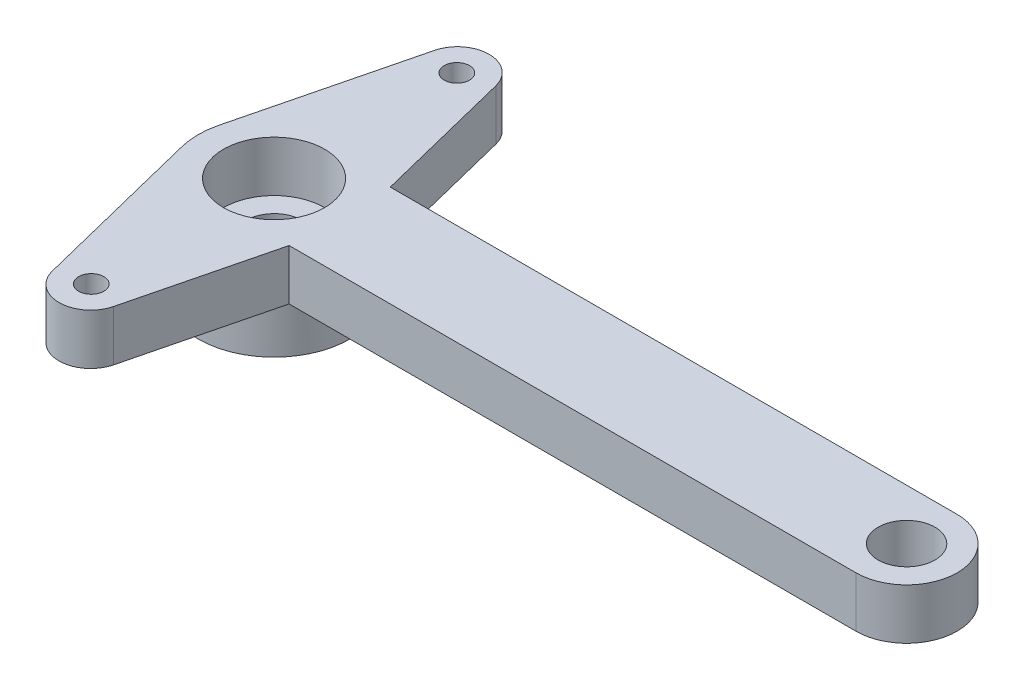
ISO-10303-21;
HEADER;
FILE_DESCRIPTION(('STEP AP214'),'2;1');
FILE_NAME('part.step','',(''),(''),'','','');
FILE_SCHEMA(('AUTOMOTIVE_DESIGN { 1 0 10303 214 1 1 1 1 }'));
ENDSEC;
DATA;
#1=APPLICATION_CONTEXT('core data for automotive mechanical design processes');
#2=APPLICATION_PROTOCOL_DEFINITION('international standard','automotive_design',2000,#1);
#3=PRODUCT_CONTEXT('',#1,'mechanical');
#4=PRODUCT('Part','Part','',(#3));
#5=PRODUCT_RELATED_PRODUCT_CATEGORY('part','',(#4));
#6=PRODUCT_DEFINITION_FORMATION('','',#4);
#7=PRODUCT_DEFINITION_CONTEXT('part definition',#1,'design');
#8=PRODUCT_DEFINITION('design','',#6,#7);
#9=PRODUCT_DEFINITION_SHAPE('','',#8);
#10=(LENGTH_UNIT() NAMED_UNIT(*) SI_UNIT(.MILLI.,.METRE.));
#11=(NAMED_UNIT(*) PLANE_ANGLE_UNIT() SI_UNIT($,.RADIAN.));
#12=(NAMED_UNIT(*) SI_UNIT($,.STERADIAN.) SOLID_ANGLE_UNIT());
#13=UNCERTAINTY_MEASURE_WITH_UNIT(LENGTH_MEASURE(1.E-05),#10,'distance_accuracy_value','');
#14=(GEOMETRIC_REPRESENTATION_CONTEXT(3) GLOBAL_UNCERTAINTY_ASSIGNED_CONTEXT((#13)) GLOBAL_UNIT_ASSIGNED_CONTEXT((#10,
#11,#12)) REPRESENTATION_CONTEXT('',''));
#15=CARTESIAN_POINT('',(0.,0.,0.));
#16=DIRECTION('',(0.,0.,1.));
#17=DIRECTION('',(1.,0.,0.));
#18=AXIS2_PLACEMENT_3D('',#15,#16,#17);
#19=CARTESIAN_POINT('',(0.,8.,0.));
#20=DIRECTION('',(0.,-1.,0.));
#21=DIRECTION('',(0.,0.,-1.));
#22=AXIS2_PLACEMENT_3D('',#19,#20,#21);
#23=CYLINDRICAL_SURFACE('',#22,2.25);
#24=CARTESIAN_POINT('',(0.,0.,0.));
#25=DIRECTION('',(0.,1.,0.));
#26=DIRECTION('',(0.,0.,1.));
#27=AXIS2_PLACEMENT_3D('',#24,#25,#26);
#28=CIRCLE('',#27,2.25);
#29=CARTESIAN_POINT('',(0.,0.,2.25));
#30=VERTEX_POINT('',#29);
#31=EDGE_CURVE('E182',#30,#30,#28,.T.);
#32=ORIENTED_EDGE('',*,*,#31,.F.);
#33=EDGE_LOOP('',(#32));
#34=FACE_BOUND('',#33,.T.);
#35=CARTESIAN_POINT('',(0.,4.,0.));
#36=DIRECTION('',(0.,1.,0.));
#37=DIRECTION('',(0.,0.,1.));
#38=AXIS2_PLACEMENT_3D('',#35,#36,#37);
#39=CIRCLE('',#38,2.25);
#40=CARTESIAN_POINT('',(0.,4.,2.25));
#41=VERTEX_POINT('',#40);
#42=EDGE_CURVE('E37',#41,#41,#39,.T.);
#43=ORIENTED_EDGE('',*,*,#42,.T.);
#44=EDGE_LOOP('',(#43));
#45=FACE_BOUND('',#44,.T.);
#46=ADVANCED_FACE('F33',(#34,#45),#23,.F.);
#47=CARTESIAN_POINT('',(0.,8.,0.));
#48=DIRECTION('',(0.,-1.,0.));
#49=DIRECTION('',(0.,0.,-1.));
#50=AXIS2_PLACEMENT_3D('',#47,#48,#49);
#51=CYLINDRICAL_SURFACE('',#50,6.);
#52=CARTESIAN_POINT('',(0.,0.,0.));
#53=DIRECTION('',(0.,1.,0.));
#54=DIRECTION('',(0.,0.,1.));
#55=AXIS2_PLACEMENT_3D('',#52,#53,#54);
#56=CIRCLE('',#55,6.);
#57=CARTESIAN_POINT('',(0.,0.,6.));
#58=VERTEX_POINT('',#57);
#59=EDGE_CURVE('E185',#58,#58,#56,.T.);
#60=ORIENTED_EDGE('',*,*,#59,.T.);
#61=EDGE_LOOP('',(#60));
#62=FACE_BOUND('',#61,.T.);
#63=CARTESIAN_POINT('',(0.,4.,0.));
#64=DIRECTION('',(0.,-1.,0.));
#65=DIRECTION('',(0.,0.,-1.));
#66=AXIS2_PLACEMENT_3D('',#63,#64,#65);
#67=CIRCLE('',#66,6.);
#68=CARTESIAN_POINT('',(-5.82258508116012,4.,-1.44827586206897));
#69=VERTEX_POINT('',#68);
#70=CARTESIAN_POINT('',(-5.82258508116012,4.,1.44827586206897));
#71=VERTEX_POINT('',#70);
#72=EDGE_CURVE('E50',#69,#71,#67,.T.);
#73=ORIENTED_EDGE('',*,*,#72,.T.);
#74=DIRECTION('',(0.,-1.,0.));
#75=VECTOR('',#74,1.);
#76=CARTESIAN_POINT('',(-5.82258508116012,8.,1.44827586206897));
#77=LINE('',#76,#75);
#78=CARTESIAN_POINT('',(-5.82258508116012,8.,1.44827586206897));
#79=VERTEX_POINT('',#78);
#80=EDGE_CURVE('E207',#79,#71,#77,.T.);
#81=ORIENTED_EDGE('',*,*,#80,.F.);
#82=CARTESIAN_POINT('',(0.,8.,0.));
#83=DIRECTION('',(0.,1.,0.));
#84=DIRECTION('',(0.,0.,1.));
#85=AXIS2_PLACEMENT_3D('',#82,#83,#84);
#86=CIRCLE('',#85,6.);
#87=CARTESIAN_POINT('',(-5.82258508116012,8.,-1.44827586206897));
#88=VERTEX_POINT('',#87);
#89=EDGE_CURVE('E192',#88,#79,#86,.T.);
#90=ORIENTED_EDGE('',*,*,#89,.F.);
#91=DIRECTION('',(0.,-1.,0.));
#92=VECTOR('',#91,1.);
#93=CARTESIAN_POINT('',(-5.82258508116012,8.,-1.44827586206897));
#94=LINE('',#93,#92);
#95=EDGE_CURVE('E210',#88,#69,#94,.T.);
#96=ORIENTED_EDGE('',*,*,#95,.T.);
#97=EDGE_LOOP('',(#73,#81,#90,#96));
#98=FACE_BOUND('',#97,.T.);
#99=ADVANCED_FACE('F231',(#62,#98),#51,.T.);
#100=CARTESIAN_POINT('',(0.,0.,0.));
#101=DIRECTION('',(0.,1.,0.));
#102=DIRECTION('',(0.,0.,1.));
#103=AXIS2_PLACEMENT_3D('',#100,#101,#102);
#104=PLANE('',#103);
#105=ORIENTED_EDGE('',*,*,#31,.T.);
#106=EDGE_LOOP('',(#105));
#107=FACE_BOUND('',#106,.T.);
#108=ORIENTED_EDGE('',*,*,#59,.F.);
#109=EDGE_LOOP('',(#108));
#110=FACE_BOUND('',#109,.T.);
#111=ADVANCED_FACE('F237',(#107,#110),#104,.F.);
#112=CARTESIAN_POINT('',(0.,8.,0.));
#113=DIRECTION('',(0.,1.,0.));
#114=DIRECTION('',(0.,0.,1.));
#115=AXIS2_PLACEMENT_3D('',#112,#113,#114);
#116=PLANE('',#115);
#117=CARTESIAN_POINT('',(0.,8.,0.));
#118=DIRECTION('',(0.,1.,0.));
#119=DIRECTION('',(0.,0.,1.));
#120=AXIS2_PLACEMENT_3D('',#117,#118,#119);
#121=CIRCLE('',#120,4.);
#122=CARTESIAN_POINT('',(0.,8.,4.));
#123=VERTEX_POINT('',#122);
#124=EDGE_CURVE('E313',#123,#123,#121,.T.);
#125=ORIENTED_EDGE('',*,*,#124,.F.);
#126=EDGE_LOOP('',(#125));
#127=FACE_BOUND('',#126,.T.);
#128=DIRECTION('',(0.241379310344828,0.,-0.97043084686002));
#129=VECTOR('',#128,1.);
#130=CARTESIAN_POINT('',(5.82258508116012,8.,1.44827586206897));
#131=LINE('',#130,#129);
#132=CARTESIAN_POINT('',(2.42607711715005,8.,15.1034482758621));
#133=VERTEX_POINT('',#132);
#134=CARTESIAN_POINT('',(5.18788409798652,8.,4.));
#135=VERTEX_POINT('',#134);
#136=EDGE_CURVE('E197',#133,#135,#131,.T.);
#137=ORIENTED_EDGE('',*,*,#136,.T.);
#138=DIRECTION('',(1.,0.,0.));
#139=VECTOR('',#138,1.);
#140=CARTESIAN_POINT('',(50.,8.,4.));
#141=LINE('',#140,#139);
#142=CARTESIAN_POINT('',(50.,8.,4.));
#143=VERTEX_POINT('',#142);
#144=EDGE_CURVE('E138',#135,#143,#141,.T.);
#145=ORIENTED_EDGE('',*,*,#144,.T.);
#146=CARTESIAN_POINT('',(50.,8.,0.));
#147=DIRECTION('',(0.,1.,0.));
#148=DIRECTION('',(0.,0.,1.));
#149=AXIS2_PLACEMENT_3D('',#146,#147,#148);
#150=CIRCLE('',#149,4.);
#151=CARTESIAN_POINT('',(50.,8.,-4.));
#152=VERTEX_POINT('',#151);
#153=EDGE_CURVE('E147',#143,#152,#150,.T.);
#154=ORIENTED_EDGE('',*,*,#153,.T.);
#155=DIRECTION('',(-1.,0.,0.));
#156=VECTOR('',#155,1.);
#157=CARTESIAN_POINT('',(50.,8.,-4.));
#158=LINE('',#157,#156);
#159=CARTESIAN_POINT('',(5.18788409798652,8.,-4.));
#160=VERTEX_POINT('',#159);
#161=EDGE_CURVE('E118',#152,#160,#158,.T.);
#162=ORIENTED_EDGE('',*,*,#161,.T.);
#163=DIRECTION('',(-0.241379310344828,0.,-0.97043084686002));
#164=VECTOR('',#163,1.);
#165=CARTESIAN_POINT('',(5.82258508116012,8.,-1.44827586206897));
#166=LINE('',#165,#164);
#167=CARTESIAN_POINT('',(2.42607711715005,8.,-15.1034482758621));
#168=VERTEX_POINT('',#167);
#169=EDGE_CURVE('E186',#160,#168,#166,.T.);
#170=ORIENTED_EDGE('',*,*,#169,.T.);
#171=CARTESIAN_POINT('',(0.,8.,-14.5));
#172=DIRECTION('',(0.,1.,0.));
#173=DIRECTION('',(0.,0.,1.));
#174=AXIS2_PLACEMENT_3D('',#171,#172,#173);
#175=CIRCLE('',#174,2.5);
#176=CARTESIAN_POINT('',(-2.42607711715005,8.,-15.1034482758621));
#177=VERTEX_POINT('',#176);
#178=EDGE_CURVE('E188',#168,#177,#175,.T.);
#179=ORIENTED_EDGE('',*,*,#178,.T.);
#180=DIRECTION('',(-0.241379310344828,0.,0.97043084686002));
#181=VECTOR('',#180,1.);
#182=CARTESIAN_POINT('',(-5.82258508116012,8.,-1.44827586206897));
#183=LINE('',#182,#181);
#184=EDGE_CURVE('E190',#177,#88,#183,.T.);
#185=ORIENTED_EDGE('',*,*,#184,.T.);
#186=ORIENTED_EDGE('',*,*,#89,.T.);
#187=DIRECTION('',(0.241379310344828,0.,0.97043084686002));
#188=VECTOR('',#187,1.);
#189=CARTESIAN_POINT('',(-5.82258508116012,8.,1.44827586206897));
#190=LINE('',#189,#188);
#191=CARTESIAN_POINT('',(-2.42607711715005,8.,15.1034482758621));
#192=VERTEX_POINT('',#191);
#193=EDGE_CURVE('E194',#79,#192,#190,.T.);
#194=ORIENTED_EDGE('',*,*,#193,.T.);
#195=CARTESIAN_POINT('',(0.,8.,14.5));
#196=DIRECTION('',(0.,1.,0.));
#197=DIRECTION('',(0.,0.,-1.));
#198=AXIS2_PLACEMENT_3D('',#195,#196,#197);
#199=CIRCLE('',#198,2.5);
#200=EDGE_CURVE('E58',#192,#133,#199,.T.);
#201=ORIENTED_EDGE('',*,*,#200,.T.);
#202=EDGE_LOOP('',(#137,#145,#154,#162,#170,#179,#185,#186,#194,#201));
#203=FACE_BOUND('',#202,.T.);
#204=CARTESIAN_POINT('',(0.,8.,-14.4500000000054));
#205=DIRECTION('',(0.,1.,0.));
#206=DIRECTION('',(0.,0.,1.));
#207=AXIS2_PLACEMENT_3D('',#204,#205,#206);
#208=CIRCLE('',#207,1.);
#209=CARTESIAN_POINT('',(0.,8.,-13.4500000000054));
#210=VERTEX_POINT('',#209);
#211=EDGE_CURVE('E179',#210,#210,#208,.T.);
#212=ORIENTED_EDGE('',*,*,#211,.F.);
#213=EDGE_LOOP('',(#212));
#214=FACE_BOUND('',#213,.T.);
#215=CARTESIAN_POINT('',(0.,8.,14.4500000000054));
#216=DIRECTION('',(0.,1.,0.));
#217=DIRECTION('',(0.,0.,1.));
#218=AXIS2_PLACEMENT_3D('',#215,#216,#217);
#219=CIRCLE('',#218,1.);
#220=CARTESIAN_POINT('',(0.,8.,15.4500000000054));
#221=VERTEX_POINT('',#220);
#222=EDGE_CURVE('E176',#221,#221,#219,.T.);
#223=ORIENTED_EDGE('',*,*,#222,.F.);
#224=EDGE_LOOP('',(#223));
#225=FACE_BOUND('',#224,.T.);
#226=CARTESIAN_POINT('',(50.,8.,0.));
#227=DIRECTION('',(0.,1.,0.));
#228=DIRECTION('',(0.,0.,1.));
#229=AXIS2_PLACEMENT_3D('',#226,#227,#228);
#230=CIRCLE('',#229,2.25);
#231=CARTESIAN_POINT('',(50.,8.,2.25));
#232=VERTEX_POINT('',#231);
#233=EDGE_CURVE('E143',#232,#232,#230,.T.);
#234=ORIENTED_EDGE('',*,*,#233,.F.);
#235=EDGE_LOOP('',(#234));
#236=FACE_BOUND('',#235,.T.);
#237=ADVANCED_FACE('F244',(#127,#203,#214,#225,#236),#116,.T.);
#238=CARTESIAN_POINT('',(5.82258508116012,8.,-1.44827586206897));
#239=DIRECTION('',(-0.97043084686002,0.,0.241379310344828));
#240=DIRECTION('',(0.241379310344828,0.,0.97043084686002));
#241=AXIS2_PLACEMENT_3D('',#238,#239,#240);
#242=PLANE('',#241);
#243=ORIENTED_EDGE('',*,*,#169,.F.);
#244=DIRECTION('',(0.,1.,0.));
#245=VECTOR('',#244,1.);
#246=CARTESIAN_POINT('',(5.18788409798652,4.,-4.));
#247=LINE('',#246,#245);
#248=CARTESIAN_POINT('',(5.18788409798652,4.,-4.));
#249=VERTEX_POINT('',#248);
#250=EDGE_CURVE('E123',#249,#160,#247,.T.);
#251=ORIENTED_EDGE('',*,*,#250,.F.);
#252=DIRECTION('',(-0.241379310344828,0.,-0.97043084686002));
#253=VECTOR('',#252,1.);
#254=CARTESIAN_POINT('',(5.82258508116012,4.,-1.44827586206897));
#255=LINE('',#254,#253);
#256=CARTESIAN_POINT('',(2.42607711715005,4.,-15.1034482758621));
#257=VERTEX_POINT('',#256);
#258=EDGE_CURVE('E134',#249,#257,#255,.T.);
#259=ORIENTED_EDGE('',*,*,#258,.T.);
#260=DIRECTION('',(0.,-1.,0.));
#261=VECTOR('',#260,1.);
#262=CARTESIAN_POINT('',(2.42607711715005,8.,-15.1034482758621));
#263=LINE('',#262,#261);
#264=EDGE_CURVE('E11',#168,#257,#263,.T.);
#265=ORIENTED_EDGE('',*,*,#264,.F.);
#266=EDGE_LOOP('',(#243,#251,#259,#265));
#267=FACE_BOUND('',#266,.T.);
#268=ADVANCED_FACE('F35',(#267),#242,.F.);
#269=CARTESIAN_POINT('',(0.,8.,-14.5));
#270=DIRECTION('',(0.,-1.,0.));
#271=DIRECTION('',(0.,0.,-1.));
#272=AXIS2_PLACEMENT_3D('',#269,#270,#271);
#273=CYLINDRICAL_SURFACE('',#272,2.5);
#274=ORIENTED_EDGE('',*,*,#264,.T.);
#275=CARTESIAN_POINT('',(0.,4.,-14.5));
#276=DIRECTION('',(0.,1.,0.));
#277=DIRECTION('',(0.,0.,1.));
#278=AXIS2_PLACEMENT_3D('',#275,#276,#277);
#279=CIRCLE('',#278,2.5);
#280=CARTESIAN_POINT('',(-2.42607711715005,4.,-15.1034482758621));
#281=VERTEX_POINT('',#280);
#282=EDGE_CURVE('E172',#257,#281,#279,.T.);
#283=ORIENTED_EDGE('',*,*,#282,.T.);
#284=DIRECTION('',(0.,-1.,0.));
#285=VECTOR('',#284,1.);
#286=CARTESIAN_POINT('',(-2.42607711715005,8.,-15.1034482758621));
#287=LINE('',#286,#285);
#288=EDGE_CURVE('E42',#177,#281,#287,.T.);
#289=ORIENTED_EDGE('',*,*,#288,.F.);
#290=ORIENTED_EDGE('',*,*,#178,.F.);
#291=EDGE_LOOP('',(#274,#283,#289,#290));
#292=FACE_BOUND('',#291,.T.);
#293=ADVANCED_FACE('F265',(#292),#273,.T.);
#294=CARTESIAN_POINT('',(-5.82258508116012,8.,-1.44827586206897));
#295=DIRECTION('',(0.97043084686002,0.,0.241379310344828));
#296=DIRECTION('',(0.241379310344828,0.,-0.97043084686002));
#297=AXIS2_PLACEMENT_3D('',#294,#295,#296);
#298=PLANE('',#297);
#299=ORIENTED_EDGE('',*,*,#288,.T.);
#300=DIRECTION('',(-0.241379310344828,0.,0.97043084686002));
#301=VECTOR('',#300,1.);
#302=CARTESIAN_POINT('',(-5.82258508116012,4.,-1.44827586206897));
#303=LINE('',#302,#301);
#304=EDGE_CURVE('E170',#281,#69,#303,.T.);
#305=ORIENTED_EDGE('',*,*,#304,.T.);
#306=ORIENTED_EDGE('',*,*,#95,.F.);
#307=ORIENTED_EDGE('',*,*,#184,.F.);
#308=EDGE_LOOP('',(#299,#305,#306,#307));
#309=FACE_BOUND('',#308,.T.);
#310=ADVANCED_FACE('F261',(#309),#298,.F.);
#311=CARTESIAN_POINT('',(-5.82258508116012,8.,1.44827586206897));
#312=DIRECTION('',(0.97043084686002,0.,-0.241379310344828));
#313=DIRECTION('',(-0.241379310344828,0.,-0.97043084686002));
#314=AXIS2_PLACEMENT_3D('',#311,#312,#313);
#315=PLANE('',#314);
#316=ORIENTED_EDGE('',*,*,#80,.T.);
#317=DIRECTION('',(0.241379310344828,0.,0.97043084686002));
#318=VECTOR('',#317,1.);
#319=CARTESIAN_POINT('',(-5.82258508116012,4.,1.44827586206897));
#320=LINE('',#319,#318);
#321=CARTESIAN_POINT('',(-2.42607711715005,4.,15.1034482758621));
#322=VERTEX_POINT('',#321);
#323=EDGE_CURVE('E167',#71,#322,#320,.T.);
#324=ORIENTED_EDGE('',*,*,#323,.T.);
#325=DIRECTION('',(0.,-1.,0.));
#326=VECTOR('',#325,1.);
#327=CARTESIAN_POINT('',(-2.42607711715005,8.,15.1034482758621));
#328=LINE('',#327,#326);
#329=EDGE_CURVE('E204',#192,#322,#328,.T.);
#330=ORIENTED_EDGE('',*,*,#329,.F.);
#331=ORIENTED_EDGE('',*,*,#193,.F.);
#332=EDGE_LOOP('',(#316,#324,#330,#331));
#333=FACE_BOUND('',#332,.T.);
#334=ADVANCED_FACE('F258',(#333),#315,.F.);
#335=CARTESIAN_POINT('',(0.,8.,14.5));
#336=DIRECTION('',(0.,-1.,0.));
#337=DIRECTION('',(0.,0.,-1.));
#338=AXIS2_PLACEMENT_3D('',#335,#336,#337);
#339=CYLINDRICAL_SURFACE('',#338,2.5);
#340=ORIENTED_EDGE('',*,*,#329,.T.);
#341=CARTESIAN_POINT('',(0.,4.,14.5));
#342=DIRECTION('',(0.,1.,0.));
#343=DIRECTION('',(0.,0.,1.));
#344=AXIS2_PLACEMENT_3D('',#341,#342,#343);
#345=CIRCLE('',#344,2.5);
#346=CARTESIAN_POINT('',(2.42607711715005,4.,15.1034482758621));
#347=VERTEX_POINT('',#346);
#348=EDGE_CURVE('E164',#322,#347,#345,.T.);
#349=ORIENTED_EDGE('',*,*,#348,.T.);
#350=DIRECTION('',(0.,-1.,0.));
#351=VECTOR('',#350,1.);
#352=CARTESIAN_POINT('',(2.42607711715005,8.,15.1034482758621));
#353=LINE('',#352,#351);
#354=EDGE_CURVE('E199',#133,#347,#353,.T.);
#355=ORIENTED_EDGE('',*,*,#354,.F.);
#356=ORIENTED_EDGE('',*,*,#200,.F.);
#357=EDGE_LOOP('',(#340,#349,#355,#356));
#358=FACE_BOUND('',#357,.T.);
#359=ADVANCED_FACE('F254',(#358),#339,.T.);
#360=CARTESIAN_POINT('',(5.82258508116012,8.,1.44827586206897));
#361=DIRECTION('',(-0.97043084686002,0.,-0.241379310344828));
#362=DIRECTION('',(-0.241379310344828,0.,0.97043084686002));
#363=AXIS2_PLACEMENT_3D('',#360,#361,#362);
#364=PLANE('',#363);
#365=DIRECTION('',(0.241379310344828,0.,-0.97043084686002));
#366=VECTOR('',#365,1.);
#367=CARTESIAN_POINT('',(5.82258508116012,4.,1.44827586206897));
#368=LINE('',#367,#366);
#369=CARTESIAN_POINT('',(5.18788409798652,4.,4.));
#370=VERTEX_POINT('',#369);
#371=EDGE_CURVE('E161',#347,#370,#368,.T.);
#372=ORIENTED_EDGE('',*,*,#371,.T.);
#373=DIRECTION('',(0.,1.,0.));
#374=VECTOR('',#373,1.);
#375=CARTESIAN_POINT('',(5.18788409798652,4.,4.));
#376=LINE('',#375,#374);
#377=EDGE_CURVE('E152',#370,#135,#376,.T.);
#378=ORIENTED_EDGE('',*,*,#377,.T.);
#379=ORIENTED_EDGE('',*,*,#136,.F.);
#380=ORIENTED_EDGE('',*,*,#354,.T.);
#381=EDGE_LOOP('',(#372,#378,#379,#380));
#382=FACE_BOUND('',#381,.T.);
#383=ADVANCED_FACE('F251',(#382),#364,.F.);
#384=CARTESIAN_POINT('',(0.,10.,14.4500000000054));
#385=DIRECTION('',(0.,-1.,0.));
#386=DIRECTION('',(0.,0.,-1.));
#387=AXIS2_PLACEMENT_3D('',#384,#385,#386);
#388=CYLINDRICAL_SURFACE('',#387,1.);
#389=CARTESIAN_POINT('',(0.,4.,14.4500000000054));
#390=DIRECTION('',(0.,1.,0.));
#391=DIRECTION('',(0.,0.,1.));
#392=AXIS2_PLACEMENT_3D('',#389,#390,#391);
#393=CIRCLE('',#392,1.);
#394=CARTESIAN_POINT('',(0.,4.,15.4500000000054));
#395=VERTEX_POINT('',#394);
#396=EDGE_CURVE('E158',#395,#395,#393,.F.);
#397=ORIENTED_EDGE('',*,*,#396,.T.);
#398=EDGE_LOOP('',(#397));
#399=FACE_BOUND('',#398,.T.);
#400=ORIENTED_EDGE('',*,*,#222,.T.);
#401=EDGE_LOOP('',(#400));
#402=FACE_BOUND('',#401,.T.);
#403=ADVANCED_FACE('F228',(#399,#402),#388,.F.);
#404=CARTESIAN_POINT('',(0.,10.,-14.4500000000054));
#405=DIRECTION('',(0.,-1.,0.));
#406=DIRECTION('',(0.,0.,-1.));
#407=AXIS2_PLACEMENT_3D('',#404,#405,#406);
#408=CYLINDRICAL_SURFACE('',#407,1.);
#409=CARTESIAN_POINT('',(0.,4.,-14.4500000000054));
#410=DIRECTION('',(0.,1.,0.));
#411=DIRECTION('',(0.,0.,1.));
#412=AXIS2_PLACEMENT_3D('',#409,#410,#411);
#413=CIRCLE('',#412,1.);
#414=CARTESIAN_POINT('',(0.,4.,-13.4500000000054));
#415=VERTEX_POINT('',#414);
#416=EDGE_CURVE('E157',#415,#415,#413,.F.);
#417=ORIENTED_EDGE('',*,*,#416,.T.);
#418=EDGE_LOOP('',(#417));
#419=FACE_BOUND('',#418,.T.);
#420=ORIENTED_EDGE('',*,*,#211,.T.);
#421=EDGE_LOOP('',(#420));
#422=FACE_BOUND('',#421,.T.);
#423=ADVANCED_FACE('F217',(#419,#422),#408,.F.);
#424=CARTESIAN_POINT('',(0.,4.,-6.));
#425=DIRECTION('',(0.,1.,0.));
#426=DIRECTION('',(0.,0.,1.));
#427=AXIS2_PLACEMENT_3D('',#424,#425,#426);
#428=PLANE('',#427);
#429=ORIENTED_EDGE('',*,*,#416,.F.);
#430=EDGE_LOOP('',(#429));
#431=FACE_BOUND('',#430,.T.);
#432=ORIENTED_EDGE('',*,*,#258,.F.);
#433=DIRECTION('',(-1.,0.,0.));
#434=VECTOR('',#433,1.);
#435=CARTESIAN_POINT('',(50.,4.,-4.));
#436=LINE('',#435,#434);
#437=CARTESIAN_POINT('',(50.,4.,-4.));
#438=VERTEX_POINT('',#437);
#439=EDGE_CURVE('E115',#438,#249,#436,.T.);
#440=ORIENTED_EDGE('',*,*,#439,.F.);
#441=CARTESIAN_POINT('',(50.,4.,0.));
#442=DIRECTION('',(0.,1.,0.));
#443=DIRECTION('',(0.,0.,1.));
#444=AXIS2_PLACEMENT_3D('',#441,#442,#443);
#445=CIRCLE('',#444,4.);
#446=CARTESIAN_POINT('',(50.,4.,4.));
#447=VERTEX_POINT('',#446);
#448=EDGE_CURVE('E131',#447,#438,#445,.T.);
#449=ORIENTED_EDGE('',*,*,#448,.F.);
#450=DIRECTION('',(1.,0.,0.));
#451=VECTOR('',#450,1.);
#452=CARTESIAN_POINT('',(50.,4.,4.));
#453=LINE('',#452,#451);
#454=EDGE_CURVE('E124',#370,#447,#453,.T.);
#455=ORIENTED_EDGE('',*,*,#454,.F.);
#456=ORIENTED_EDGE('',*,*,#371,.F.);
#457=ORIENTED_EDGE('',*,*,#348,.F.);
#458=ORIENTED_EDGE('',*,*,#323,.F.);
#459=ORIENTED_EDGE('',*,*,#72,.F.);
#460=ORIENTED_EDGE('',*,*,#304,.F.);
#461=ORIENTED_EDGE('',*,*,#282,.F.);
#462=EDGE_LOOP('',(#432,#440,#449,#455,#456,#457,#458,#459,#460,#461));
#463=FACE_BOUND('',#462,.T.);
#464=ORIENTED_EDGE('',*,*,#396,.F.);
#465=EDGE_LOOP('',(#464));
#466=FACE_BOUND('',#465,.T.);
#467=CARTESIAN_POINT('',(50.,4.,0.));
#468=DIRECTION('',(0.,1.,0.));
#469=DIRECTION('',(0.,0.,1.));
#470=AXIS2_PLACEMENT_3D('',#467,#468,#469);
#471=CIRCLE('',#470,2.25);
#472=CARTESIAN_POINT('',(50.,4.,2.25));
#473=VERTEX_POINT('',#472);
#474=EDGE_CURVE('E149',#473,#473,#471,.T.);
#475=ORIENTED_EDGE('',*,*,#474,.T.);
#476=EDGE_LOOP('',(#475));
#477=FACE_BOUND('',#476,.T.);
#478=ADVANCED_FACE('F128',(#431,#463,#466,#477),#428,.F.);
#479=CARTESIAN_POINT('',(50.,4.,0.));
#480=DIRECTION('',(0.,1.,0.));
#481=DIRECTION('',(0.,0.,1.));
#482=AXIS2_PLACEMENT_3D('',#479,#480,#481);
#483=CYLINDRICAL_SURFACE('',#482,4.);
#484=ORIENTED_EDGE('',*,*,#153,.F.);
#485=DIRECTION('',(0.,1.,0.));
#486=VECTOR('',#485,1.);
#487=CARTESIAN_POINT('',(50.,4.,4.));
#488=LINE('',#487,#486);
#489=EDGE_CURVE('E137',#447,#143,#488,.T.);
#490=ORIENTED_EDGE('',*,*,#489,.F.);
#491=ORIENTED_EDGE('',*,*,#448,.T.);
#492=DIRECTION('',(0.,1.,0.));
#493=VECTOR('',#492,1.);
#494=CARTESIAN_POINT('',(50.,4.,-4.));
#495=LINE('',#494,#493);
#496=EDGE_CURVE('E112',#438,#152,#495,.T.);
#497=ORIENTED_EDGE('',*,*,#496,.T.);
#498=EDGE_LOOP('',(#484,#490,#491,#497));
#499=FACE_BOUND('',#498,.T.);
#500=ADVANCED_FACE('F136',(#499),#483,.T.);
#501=CARTESIAN_POINT('',(50.,4.,4.));
#502=DIRECTION('',(0.,0.,1.));
#503=DIRECTION('',(1.,0.,0.));
#504=AXIS2_PLACEMENT_3D('',#501,#502,#503);
#505=PLANE('',#504);
#506=ORIENTED_EDGE('',*,*,#144,.F.);
#507=ORIENTED_EDGE('',*,*,#377,.F.);
#508=ORIENTED_EDGE('',*,*,#454,.T.);
#509=ORIENTED_EDGE('',*,*,#489,.T.);
#510=EDGE_LOOP('',(#506,#507,#508,#509));
#511=FACE_BOUND('',#510,.T.);
#512=ADVANCED_FACE('F226',(#511),#505,.T.);
#513=CARTESIAN_POINT('',(50.,4.,-4.));
#514=DIRECTION('',(0.,0.,-1.));
#515=DIRECTION('',(-1.,0.,0.));
#516=AXIS2_PLACEMENT_3D('',#513,#514,#515);
#517=PLANE('',#516);
#518=ORIENTED_EDGE('',*,*,#161,.F.);
#519=ORIENTED_EDGE('',*,*,#496,.F.);
#520=ORIENTED_EDGE('',*,*,#439,.T.);
#521=ORIENTED_EDGE('',*,*,#250,.T.);
#522=EDGE_LOOP('',(#518,#519,#520,#521));
#523=FACE_BOUND('',#522,.T.);
#524=ADVANCED_FACE('F114',(#523),#517,.T.);
#525=CARTESIAN_POINT('',(50.,4.,0.));
#526=DIRECTION('',(0.,1.,0.));
#527=DIRECTION('',(0.,0.,1.));
#528=AXIS2_PLACEMENT_3D('',#525,#526,#527);
#529=CYLINDRICAL_SURFACE('',#528,2.25);
#530=ORIENTED_EDGE('',*,*,#474,.F.);
#531=EDGE_LOOP('',(#530));
#532=FACE_BOUND('',#531,.T.);
#533=ORIENTED_EDGE('',*,*,#233,.T.);
#534=EDGE_LOOP('',(#533));
#535=FACE_BOUND('',#534,.T.);
#536=ADVANCED_FACE('F292',(#532,#535),#529,.F.);
#537=CARTESIAN_POINT('',(0.,4.,0.));
#538=DIRECTION('',(0.,1.,0.));
#539=DIRECTION('',(0.,0.,1.));
#540=AXIS2_PLACEMENT_3D('',#537,#538,#539);
#541=CYLINDRICAL_SURFACE('',#540,4.);
#542=CARTESIAN_POINT('',(0.,4.,0.));
#543=DIRECTION('',(0.,1.,0.));
#544=DIRECTION('',(0.,0.,1.));
#545=AXIS2_PLACEMENT_3D('',#542,#543,#544);
#546=CIRCLE('',#545,4.);
#547=CARTESIAN_POINT('',(0.,4.,4.));
#548=VERTEX_POINT('',#547);
#549=EDGE_CURVE('E312',#548,#548,#546,.T.);
#550=ORIENTED_EDGE('',*,*,#549,.F.);
#551=EDGE_LOOP('',(#550));
#552=FACE_BOUND('',#551,.T.);
#553=ORIENTED_EDGE('',*,*,#124,.T.);
#554=EDGE_LOOP('',(#553));
#555=FACE_BOUND('',#554,.T.);
#556=ADVANCED_FACE('F297',(#552,#555),#541,.F.);
#557=CARTESIAN_POINT('',(0.,4.,0.));
#558=DIRECTION('',(0.,1.,0.));
#559=DIRECTION('',(0.,0.,1.));
#560=AXIS2_PLACEMENT_3D('',#557,#558,#559);
#561=PLANE('',#560);
#562=ORIENTED_EDGE('',*,*,#42,.F.);
#563=EDGE_LOOP('',(#562));
#564=FACE_BOUND('',#563,.T.);
#565=ORIENTED_EDGE('',*,*,#549,.T.);
#566=EDGE_LOOP('',(#565));
#567=FACE_BOUND('',#566,.T.);
#568=ADVANCED_FACE('F301',(#564,#567),#561,.T.);
#569=CLOSED_SHELL('',(#46,#99,#111,#237,#268,#293,#310,#334,#359,#383,#403,#423,#478,#500,#512,
#524,#536,#556,#568));
#570=MANIFOLD_SOLID_BREP('B2',#569);
#571=ADVANCED_BREP_SHAPE_REPRESENTATION('',(#18,#570),#14);
#572=SHAPE_DEFINITION_REPRESENTATION(#9,#571);
ENDSEC;
END-ISO-10303-21;
